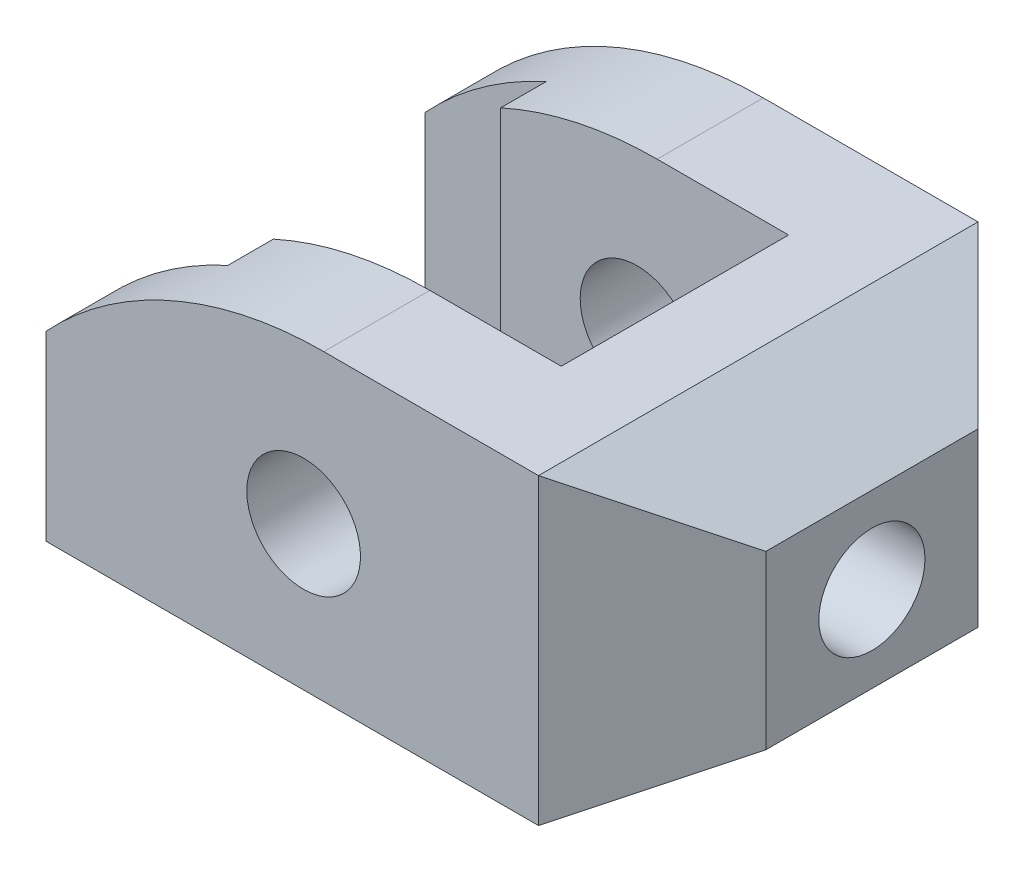
ISO-10303-21;
HEADER;
FILE_DESCRIPTION(('STEP AP214'),'2;1');
FILE_NAME('part.step','',(''),(''),'','','');
FILE_SCHEMA(('AUTOMOTIVE_DESIGN { 1 0 10303 214 1 1 1 1 }'));
ENDSEC;
DATA;
#1=APPLICATION_CONTEXT('core data for automotive mechanical design processes');
#2=APPLICATION_PROTOCOL_DEFINITION('international standard','automotive_design',2000,#1);
#3=PRODUCT_CONTEXT('',#1,'mechanical');
#4=PRODUCT('Part','Part','',(#3));
#5=PRODUCT_RELATED_PRODUCT_CATEGORY('part','',(#4));
#6=PRODUCT_DEFINITION_FORMATION('','',#4);
#7=PRODUCT_DEFINITION_CONTEXT('part definition',#1,'design');
#8=PRODUCT_DEFINITION('design','',#6,#7);
#9=PRODUCT_DEFINITION_SHAPE('','',#8);
#10=(LENGTH_UNIT() NAMED_UNIT(*) SI_UNIT(.MILLI.,.METRE.));
#11=(NAMED_UNIT(*) PLANE_ANGLE_UNIT() SI_UNIT($,.RADIAN.));
#12=(NAMED_UNIT(*) SI_UNIT($,.STERADIAN.) SOLID_ANGLE_UNIT());
#13=UNCERTAINTY_MEASURE_WITH_UNIT(LENGTH_MEASURE(1.E-05),#10,'distance_accuracy_value','');
#14=(GEOMETRIC_REPRESENTATION_CONTEXT(3) GLOBAL_UNCERTAINTY_ASSIGNED_CONTEXT((#13)) GLOBAL_UNIT_ASSIGNED_CONTEXT((#10,
#11,#12)) REPRESENTATION_CONTEXT('',''));
#15=CARTESIAN_POINT('',(0.,0.,0.));
#16=DIRECTION('',(0.,0.,1.));
#17=DIRECTION('',(1.,0.,0.));
#18=AXIS2_PLACEMENT_3D('',#15,#16,#17);
#19=CARTESIAN_POINT('',(36.6606055596467,-10.,29.));
#20=DIRECTION('',(0.,0.,1.));
#21=DIRECTION('',(1.,0.,0.));
#22=AXIS2_PLACEMENT_3D('',#19,#20,#21);
#23=PLANE('',#22);
#24=CARTESIAN_POINT('',(34.,19.,29.));
#25=DIRECTION('',(0.,0.,1.));
#26=DIRECTION('',(1.,0.,0.));
#27=AXIS2_PLACEMENT_3D('',#24,#25,#26);
#28=CIRCLE('',#27,7.5);
#29=CARTESIAN_POINT('',(26.5,19.,29.));
#30=VERTEX_POINT('',#29);
#31=EDGE_CURVE('E254',#30,#30,#28,.T.);
#32=ORIENTED_EDGE('',*,*,#31,.F.);
#33=EDGE_LOOP('',(#32));
#34=FACE_BOUND('',#33,.T.);
#35=DIRECTION('',(1.,0.,0.));
#36=VECTOR('',#35,1.);
#37=CARTESIAN_POINT('',(0.,0.,29.));
#38=LINE('',#37,#36);
#39=CARTESIAN_POINT('',(0.,0.,29.));
#40=VERTEX_POINT('',#39);
#41=CARTESIAN_POINT('',(65.,0.,29.));
#42=VERTEX_POINT('',#41);
#43=EDGE_CURVE('E232',#40,#42,#38,.T.);
#44=ORIENTED_EDGE('',*,*,#43,.T.);
#45=DIRECTION('',(0.,-1.,0.));
#46=VECTOR('',#45,1.);
#47=CARTESIAN_POINT('',(65.,72.,29.));
#48=LINE('',#47,#46);
#49=CARTESIAN_POINT('',(65.,40.,29.));
#50=VERTEX_POINT('',#49);
#51=EDGE_CURVE('E222',#50,#42,#48,.T.);
#52=ORIENTED_EDGE('',*,*,#51,.F.);
#53=DIRECTION('',(-1.,0.,0.));
#54=VECTOR('',#53,1.);
#55=CARTESIAN_POINT('',(65.,40.,29.));
#56=LINE('',#55,#54);
#57=CARTESIAN_POINT('',(36.6606055596467,40.,29.));
#58=VERTEX_POINT('',#57);
#59=EDGE_CURVE('E229',#50,#58,#56,.T.);
#60=ORIENTED_EDGE('',*,*,#59,.T.);
#61=CARTESIAN_POINT('',(36.6606055596467,-10.,29.));
#62=DIRECTION('',(0.,0.,1.));
#63=DIRECTION('',(1.,0.,0.));
#64=AXIS2_PLACEMENT_3D('',#61,#62,#63);
#65=CIRCLE('',#64,50.);
#66=CARTESIAN_POINT('',(0.,24.,29.));
#67=VERTEX_POINT('',#66);
#68=EDGE_CURVE('E246',#58,#67,#65,.T.);
#69=ORIENTED_EDGE('',*,*,#68,.T.);
#70=DIRECTION('',(0.,-1.,0.));
#71=VECTOR('',#70,1.);
#72=CARTESIAN_POINT('',(0.,0.,29.));
#73=LINE('',#72,#71);
#74=EDGE_CURVE('E250',#67,#40,#73,.T.);
#75=ORIENTED_EDGE('',*,*,#74,.T.);
#76=EDGE_LOOP('',(#44,#52,#60,#69,#75));
#77=FACE_BOUND('',#76,.T.);
#78=ADVANCED_FACE('F37',(#34,#77),#23,.T.);
#79=CARTESIAN_POINT('',(36.6606055596467,-10.,-29.));
#80=DIRECTION('',(0.,0.,1.));
#81=DIRECTION('',(1.,0.,0.));
#82=AXIS2_PLACEMENT_3D('',#79,#80,#81);
#83=PLANE('',#82);
#84=CARTESIAN_POINT('',(34.,19.,-29.));
#85=DIRECTION('',(0.,0.,1.));
#86=DIRECTION('',(1.,0.,0.));
#87=AXIS2_PLACEMENT_3D('',#84,#85,#86);
#88=CIRCLE('',#87,7.5);
#89=CARTESIAN_POINT('',(26.5,19.,-29.));
#90=VERTEX_POINT('',#89);
#91=EDGE_CURVE('E319',#90,#90,#88,.T.);
#92=ORIENTED_EDGE('',*,*,#91,.T.);
#93=EDGE_LOOP('',(#92));
#94=FACE_BOUND('',#93,.T.);
#95=DIRECTION('',(0.,-1.,0.));
#96=VECTOR('',#95,1.);
#97=CARTESIAN_POINT('',(65.,72.,-29.));
#98=LINE('',#97,#96);
#99=CARTESIAN_POINT('',(65.,40.,-29.));
#100=VERTEX_POINT('',#99);
#101=CARTESIAN_POINT('',(65.,0.,-29.));
#102=VERTEX_POINT('',#101);
#103=EDGE_CURVE('E152',#100,#102,#98,.T.);
#104=ORIENTED_EDGE('',*,*,#103,.T.);
#105=DIRECTION('',(1.,0.,0.));
#106=VECTOR('',#105,1.);
#107=CARTESIAN_POINT('',(0.,0.,-29.));
#108=LINE('',#107,#106);
#109=CARTESIAN_POINT('',(0.,0.,-29.));
#110=VERTEX_POINT('',#109);
#111=EDGE_CURVE('E168',#110,#102,#108,.T.);
#112=ORIENTED_EDGE('',*,*,#111,.F.);
#113=DIRECTION('',(0.,-1.,0.));
#114=VECTOR('',#113,1.);
#115=CARTESIAN_POINT('',(0.,0.,-29.));
#116=LINE('',#115,#114);
#117=CARTESIAN_POINT('',(0.,24.,-29.));
#118=VERTEX_POINT('',#117);
#119=EDGE_CURVE('E182',#118,#110,#116,.T.);
#120=ORIENTED_EDGE('',*,*,#119,.F.);
#121=CARTESIAN_POINT('',(36.6606055596467,-10.,-29.));
#122=DIRECTION('',(0.,0.,1.));
#123=DIRECTION('',(1.,0.,0.));
#124=AXIS2_PLACEMENT_3D('',#121,#122,#123);
#125=CIRCLE('',#124,50.);
#126=CARTESIAN_POINT('',(36.6606055596467,40.,-29.));
#127=VERTEX_POINT('',#126);
#128=EDGE_CURVE('E257',#127,#118,#125,.T.);
#129=ORIENTED_EDGE('',*,*,#128,.F.);
#130=DIRECTION('',(-1.,0.,0.));
#131=VECTOR('',#130,1.);
#132=CARTESIAN_POINT('',(65.,40.,-29.));
#133=LINE('',#132,#131);
#134=EDGE_CURVE('E172',#100,#127,#133,.T.);
#135=ORIENTED_EDGE('',*,*,#134,.F.);
#136=EDGE_LOOP('',(#104,#112,#120,#129,#135));
#137=FACE_BOUND('',#136,.T.);
#138=ADVANCED_FACE('F166',(#94,#137),#83,.F.);
#139=CARTESIAN_POINT('',(65.,0.,29.));
#140=DIRECTION('',(-0.500000000000001,0.866025403784438,0.));
#141=DIRECTION('',(-0.866025403784438,-0.500000000000001,0.));
#142=AXIS2_PLACEMENT_3D('',#139,#140,#141);
#143=PLANE('',#142);
#144=DIRECTION('',(-0.65465367070798,-0.37796447300923,-0.654653670707973));
#145=VECTOR('',#144,1.);
#146=CARTESIAN_POINT('',(89.8571428571428,14.3512781198564,-4.14285714285749));
#147=LINE('',#146,#145);
#148=CARTESIAN_POINT('',(80.,8.66025403784441,-14.0000000000002));
#149=VERTEX_POINT('',#148);
#150=EDGE_CURVE('E149',#149,#102,#147,.T.);
#151=ORIENTED_EDGE('',*,*,#150,.F.);
#152=DIRECTION('',(0.,0.,-1.));
#153=VECTOR('',#152,1.);
#154=CARTESIAN_POINT('',(80.,8.66025403784442,29.));
#155=LINE('',#154,#153);
#156=CARTESIAN_POINT('',(80.,8.66025403784441,14.0000000000002));
#157=VERTEX_POINT('',#156);
#158=EDGE_CURVE('E187',#157,#149,#155,.T.);
#159=ORIENTED_EDGE('',*,*,#158,.F.);
#160=DIRECTION('',(0.65465367070798,0.37796447300923,-0.654653670707973));
#161=VECTOR('',#160,1.);
#162=CARTESIAN_POINT('',(65.,0.,29.));
#163=LINE('',#162,#161);
#164=EDGE_CURVE('E160',#42,#157,#163,.T.);
#165=ORIENTED_EDGE('',*,*,#164,.F.);
#166=DIRECTION('',(0.,0.,-1.));
#167=VECTOR('',#166,1.);
#168=CARTESIAN_POINT('',(65.,0.,29.));
#169=LINE('',#168,#167);
#170=EDGE_CURVE('E178',#42,#102,#169,.T.);
#171=ORIENTED_EDGE('',*,*,#170,.T.);
#172=EDGE_LOOP('',(#151,#159,#165,#171));
#173=FACE_BOUND('',#172,.T.);
#174=ADVANCED_FACE('F185',(#173),#143,.F.);
#175=CARTESIAN_POINT('',(80.,8.66025403784442,29.));
#176=DIRECTION('',(-1.,0.,0.));
#177=DIRECTION('',(0.,0.,1.));
#178=AXIS2_PLACEMENT_3D('',#175,#176,#177);
#179=PLANE('',#178);
#180=CARTESIAN_POINT('',(80.,20.,0.));
#181=DIRECTION('',(-1.,0.,0.));
#182=DIRECTION('',(0.,0.,1.));
#183=AXIS2_PLACEMENT_3D('',#180,#181,#182);
#184=CIRCLE('',#183,7.);
#185=CARTESIAN_POINT('',(80.,20.,7.));
#186=VERTEX_POINT('',#185);
#187=EDGE_CURVE('E233',#186,#186,#184,.T.);
#188=ORIENTED_EDGE('',*,*,#187,.T.);
#189=EDGE_LOOP('',(#188));
#190=FACE_BOUND('',#189,.T.);
#191=DIRECTION('',(0.,-1.,0.));
#192=VECTOR('',#191,1.);
#193=CARTESIAN_POINT('',(80.,72.,-14.0000000000002));
#194=LINE('',#193,#192);
#195=CARTESIAN_POINT('',(80.,31.3397459621556,-14.0000000000002));
#196=VERTEX_POINT('',#195);
#197=EDGE_CURVE('E155',#196,#149,#194,.T.);
#198=ORIENTED_EDGE('',*,*,#197,.F.);
#199=DIRECTION('',(0.,0.,-1.));
#200=VECTOR('',#199,1.);
#201=CARTESIAN_POINT('',(80.,31.3397459621556,29.));
#202=LINE('',#201,#200);
#203=CARTESIAN_POINT('',(80.,31.3397459621556,14.0000000000002));
#204=VERTEX_POINT('',#203);
#205=EDGE_CURVE('E191',#204,#196,#202,.T.);
#206=ORIENTED_EDGE('',*,*,#205,.F.);
#207=DIRECTION('',(0.,-1.,0.));
#208=VECTOR('',#207,1.);
#209=CARTESIAN_POINT('',(80.,72.,14.0000000000002));
#210=LINE('',#209,#208);
#211=EDGE_CURVE('E53',#204,#157,#210,.T.);
#212=ORIENTED_EDGE('',*,*,#211,.T.);
#213=ORIENTED_EDGE('',*,*,#158,.T.);
#214=EDGE_LOOP('',(#198,#206,#212,#213));
#215=FACE_BOUND('',#214,.T.);
#216=ADVANCED_FACE('F265',(#190,#215),#179,.F.);
#217=CARTESIAN_POINT('',(80.,31.3397459621556,29.));
#218=DIRECTION('',(-0.500000000000001,-0.866025403784438,0.));
#219=DIRECTION('',(0.866025403784438,-0.500000000000001,0.));
#220=AXIS2_PLACEMENT_3D('',#217,#218,#219);
#221=PLANE('',#220);
#222=DIRECTION('',(0.65465367070798,-0.37796447300923,0.654653670707973));
#223=VECTOR('',#222,1.);
#224=CARTESIAN_POINT('',(98.4285714285714,20.7000052870896,4.42857142857107));
#225=LINE('',#224,#223);
#226=EDGE_CURVE('E11',#100,#196,#225,.T.);
#227=ORIENTED_EDGE('',*,*,#226,.F.);
#228=DIRECTION('',(0.,0.,-1.));
#229=VECTOR('',#228,1.);
#230=CARTESIAN_POINT('',(65.,40.,29.));
#231=LINE('',#230,#229);
#232=EDGE_CURVE('E236',#50,#100,#231,.T.);
#233=ORIENTED_EDGE('',*,*,#232,.F.);
#234=DIRECTION('',(-0.65465367070798,0.37796447300923,0.654653670707973));
#235=VECTOR('',#234,1.);
#236=CARTESIAN_POINT('',(73.5714285714287,35.051283406946,20.4285714285714));
#237=LINE('',#236,#235);
#238=EDGE_CURVE('E46',#204,#50,#237,.T.);
#239=ORIENTED_EDGE('',*,*,#238,.F.);
#240=ORIENTED_EDGE('',*,*,#205,.T.);
#241=EDGE_LOOP('',(#227,#233,#239,#240));
#242=FACE_BOUND('',#241,.T.);
#243=ADVANCED_FACE('F237',(#242),#221,.F.);
#244=CARTESIAN_POINT('',(0.,0.,29.));
#245=DIRECTION('',(1.,0.,0.));
#246=DIRECTION('',(0.,0.,-1.));
#247=AXIS2_PLACEMENT_3D('',#244,#245,#246);
#248=PLANE('',#247);
#249=DIRECTION('',(0.,0.,-1.));
#250=VECTOR('',#249,1.);
#251=CARTESIAN_POINT('',(0.,0.,29.));
#252=LINE('',#251,#250);
#253=CARTESIAN_POINT('',(0.,0.,-21.));
#254=VERTEX_POINT('',#253);
#255=EDGE_CURVE('E181',#254,#110,#252,.T.);
#256=ORIENTED_EDGE('',*,*,#255,.F.);
#257=DIRECTION('',(0.,1.,0.));
#258=VECTOR('',#257,1.);
#259=CARTESIAN_POINT('',(0.,-1.2E-05,-21.));
#260=LINE('',#259,#258);
#261=CARTESIAN_POINT('',(0.,24.,-21.));
#262=VERTEX_POINT('',#261);
#263=EDGE_CURVE('E201',#254,#262,#260,.T.);
#264=ORIENTED_EDGE('',*,*,#263,.T.);
#265=DIRECTION('',(0.,0.,-1.));
#266=VECTOR('',#265,1.);
#267=CARTESIAN_POINT('',(0.,24.,29.));
#268=LINE('',#267,#266);
#269=EDGE_CURVE('E248',#262,#118,#268,.T.);
#270=ORIENTED_EDGE('',*,*,#269,.T.);
#271=ORIENTED_EDGE('',*,*,#119,.T.);
#272=EDGE_LOOP('',(#256,#264,#270,#271));
#273=FACE_BOUND('',#272,.T.);
#274=ADVANCED_FACE('F352',(#273),#248,.F.);
#275=CARTESIAN_POINT('',(36.6606055596467,-10.,29.));
#276=DIRECTION('',(0.,0.,-1.));
#277=DIRECTION('',(-1.,0.,0.));
#278=AXIS2_PLACEMENT_3D('',#275,#276,#277);
#279=CYLINDRICAL_SURFACE('',#278,50.);
#280=ORIENTED_EDGE('',*,*,#269,.F.);
#281=CARTESIAN_POINT('',(36.6606055596467,-10.,-21.));
#282=DIRECTION('',(0.,0.,-1.));
#283=DIRECTION('',(-1.,0.,0.));
#284=AXIS2_PLACEMENT_3D('',#281,#282,#283);
#285=CIRCLE('',#284,50.);
#286=CARTESIAN_POINT('',(16.,35.5317403347236,-21.));
#287=VERTEX_POINT('',#286);
#288=EDGE_CURVE('E214',#262,#287,#285,.T.);
#289=ORIENTED_EDGE('',*,*,#288,.T.);
#290=DIRECTION('',(0.,0.,-1.));
#291=VECTOR('',#290,1.);
#292=CARTESIAN_POINT('',(16.,35.5317403347236,29.));
#293=LINE('',#292,#291);
#294=CARTESIAN_POINT('',(16.,35.5317403347236,-15.));
#295=VERTEX_POINT('',#294);
#296=EDGE_CURVE('E211',#287,#295,#293,.F.);
#297=ORIENTED_EDGE('',*,*,#296,.T.);
#298=CARTESIAN_POINT('',(36.6606055596467,-10.,-15.));
#299=DIRECTION('',(0.,0.,-1.));
#300=DIRECTION('',(-1.,0.,0.));
#301=AXIS2_PLACEMENT_3D('',#298,#299,#300);
#302=CIRCLE('',#301,50.);
#303=CARTESIAN_POINT('',(36.6606055596467,40.,-15.));
#304=VERTEX_POINT('',#303);
#305=EDGE_CURVE('E205',#295,#304,#302,.T.);
#306=ORIENTED_EDGE('',*,*,#305,.T.);
#307=DIRECTION('',(0.,0.,-1.));
#308=VECTOR('',#307,1.);
#309=CARTESIAN_POINT('',(36.6606055596467,40.,29.));
#310=LINE('',#309,#308);
#311=EDGE_CURVE('E263',#304,#127,#310,.T.);
#312=ORIENTED_EDGE('',*,*,#311,.T.);
#313=ORIENTED_EDGE('',*,*,#128,.T.);
#314=EDGE_LOOP('',(#280,#289,#297,#306,#312,#313));
#315=FACE_BOUND('',#314,.T.);
#316=ADVANCED_FACE('F350',(#315),#279,.T.);
#317=CARTESIAN_POINT('',(34.,19.,29.));
#318=DIRECTION('',(0.,0.,-1.));
#319=DIRECTION('',(-1.,0.,0.));
#320=AXIS2_PLACEMENT_3D('',#317,#318,#319);
#321=CYLINDRICAL_SURFACE('',#320,7.5);
#322=CARTESIAN_POINT('',(34.,19.,-15.));
#323=DIRECTION('',(0.,0.,-1.));
#324=DIRECTION('',(-1.,0.,0.));
#325=AXIS2_PLACEMENT_3D('',#322,#323,#324);
#326=CIRCLE('',#325,7.5);
#327=CARTESIAN_POINT('',(26.5,19.,-15.));
#328=VERTEX_POINT('',#327);
#329=EDGE_CURVE('E202',#328,#328,#326,.T.);
#330=CARTESIAN_POINT('',(26.5,19.,-15.));
#331=CARTESIAN_POINT('',(26.5,19.,-15.1458333333333));
#332=CARTESIAN_POINT('',(26.5,19.,-15.2916666666667));
#333=CARTESIAN_POINT('',(26.5,19.,-15.5833333333333));
#334=CARTESIAN_POINT('',(26.5,19.,-15.7291666666667));
#335=CARTESIAN_POINT('',(26.5,19.,-16.0208333333333));
#336=CARTESIAN_POINT('',(26.5,19.,-16.1666666666667));
#337=CARTESIAN_POINT('',(26.5,19.,-16.4583333333333));
#338=CARTESIAN_POINT('',(26.5,19.,-16.6041666666667));
#339=CARTESIAN_POINT('',(26.5,19.,-16.8958333333333));
#340=CARTESIAN_POINT('',(26.5,19.,-17.0416666666667));
#341=CARTESIAN_POINT('',(26.5,19.,-17.3333333333333));
#342=CARTESIAN_POINT('',(26.5,19.,-17.4791666666667));
#343=CARTESIAN_POINT('',(26.5,19.,-17.7708333333333));
#344=CARTESIAN_POINT('',(26.5,19.,-17.9166666666667));
#345=CARTESIAN_POINT('',(26.5,19.,-18.2083333333333));
#346=CARTESIAN_POINT('',(26.5,19.,-18.3541666666667));
#347=CARTESIAN_POINT('',(26.5,19.,-18.6458333333333));
#348=CARTESIAN_POINT('',(26.5,19.,-18.7916666666667));
#349=CARTESIAN_POINT('',(26.5,19.,-19.0833333333333));
#350=CARTESIAN_POINT('',(26.5,19.,-19.2291666666667));
#351=CARTESIAN_POINT('',(26.5,19.,-19.5208333333333));
#352=CARTESIAN_POINT('',(26.5,19.,-19.6666666666667));
#353=CARTESIAN_POINT('',(26.5,19.,-19.9583333333333));
#354=CARTESIAN_POINT('',(26.5,19.,-20.1041666666667));
#355=CARTESIAN_POINT('',(26.5,19.,-20.3958333333333));
#356=CARTESIAN_POINT('',(26.5,19.,-20.5416666666667));
#357=CARTESIAN_POINT('',(26.5,19.,-20.8333333333333));
#358=CARTESIAN_POINT('',(26.5,19.,-20.9791666666667));
#359=CARTESIAN_POINT('',(26.5,19.,-21.2708333333333));
#360=CARTESIAN_POINT('',(26.5,19.,-21.4166666666667));
#361=CARTESIAN_POINT('',(26.5,19.,-21.7083333333333));
#362=CARTESIAN_POINT('',(26.5,19.,-21.8541666666667));
#363=CARTESIAN_POINT('',(26.5,19.,-22.1458333333333));
#364=CARTESIAN_POINT('',(26.5,19.,-22.2916666666667));
#365=CARTESIAN_POINT('',(26.5,19.,-22.5833333333333));
#366=CARTESIAN_POINT('',(26.5,19.,-22.7291666666667));
#367=CARTESIAN_POINT('',(26.5,19.,-23.0208333333333));
#368=CARTESIAN_POINT('',(26.5,19.,-23.1666666666667));
#369=CARTESIAN_POINT('',(26.5,19.,-23.4583333333333));
#370=CARTESIAN_POINT('',(26.5,19.,-23.6041666666667));
#371=CARTESIAN_POINT('',(26.5,19.,-23.8958333333333));
#372=CARTESIAN_POINT('',(26.5,19.,-24.0416666666667));
#373=CARTESIAN_POINT('',(26.5,19.,-24.3333333333333));
#374=CARTESIAN_POINT('',(26.5,19.,-24.4791666666667));
#375=CARTESIAN_POINT('',(26.5,19.,-24.7708333333333));
#376=CARTESIAN_POINT('',(26.5,19.,-24.9166666666667));
#377=CARTESIAN_POINT('',(26.5,19.,-25.2083333333333));
#378=CARTESIAN_POINT('',(26.5,19.,-25.3541666666667));
#379=CARTESIAN_POINT('',(26.5,19.,-25.6458333333333));
#380=CARTESIAN_POINT('',(26.5,19.,-25.7916666666667));
#381=CARTESIAN_POINT('',(26.5,19.,-26.0833333333333));
#382=CARTESIAN_POINT('',(26.5,19.,-26.2291666666667));
#383=CARTESIAN_POINT('',(26.5,19.,-26.5208333333333));
#384=CARTESIAN_POINT('',(26.5,19.,-26.6666666666667));
#385=CARTESIAN_POINT('',(26.5,19.,-26.9583333333333));
#386=CARTESIAN_POINT('',(26.5,19.,-27.1041666666667));
#387=CARTESIAN_POINT('',(26.5,19.,-27.3958333333333));
#388=CARTESIAN_POINT('',(26.5,19.,-27.5416666666667));
#389=CARTESIAN_POINT('',(26.5,19.,-27.8333333333333));
#390=CARTESIAN_POINT('',(26.5,19.,-27.9791666666667));
#391=CARTESIAN_POINT('',(26.5,19.,-28.2708333333333));
#392=CARTESIAN_POINT('',(26.5,19.,-28.4166666666667));
#393=CARTESIAN_POINT('',(26.5,19.,-28.7083333333333));
#394=CARTESIAN_POINT('',(26.5,19.,-28.8541666666667));
#395=CARTESIAN_POINT('',(26.5,19.,-29.));
#396=B_SPLINE_CURVE_WITH_KNOTS('',3,(#330,#331,#332,#333,#334,#335,#336,#337,#338,#339,#340,
#341,#342,#343,#344,#345,#346,#347,#348,#349,#350,#351,#352,#353,#354,#355,#356,#357,#358,#359,
#360,#361,#362,#363,#364,#365,#366,#367,#368,#369,#370,#371,#372,#373,#374,#375,#376,#377,#378,
#379,#380,#381,#382,#383,#384,#385,#386,#387,#388,#389,#390,#391,#392,#393,#394,#395),
.UNSPECIFIED.,.F.,.F.,(4,2,2,2,2,2,2,2,2,2,2,2,2,2,2,2,2,2,2,2,2,2,2,2,2,2,2,2,2,2,2,2,4),(0.,
0.4375,0.875000000000001,1.3125,1.75,2.1875,2.625,3.0625,3.5,3.9375,4.375,4.8125,5.25,
5.68750000000001,6.12500000000001,6.56250000000001,7.00000000000001,7.43750000000001,
7.87500000000001,8.31250000000001,8.75000000000001,9.18750000000001,9.62500000000001,10.0625,
10.5,10.9375,11.375,11.8125,12.25,12.6875,13.125,13.5625,14.),.UNSPECIFIED.);
#397=EDGE_CURVE('BSEAM358',#328,#90,#396,.T.);
#398=ORIENTED_EDGE('',*,*,#329,.F.);
#399=ORIENTED_EDGE('',*,*,#91,.F.);
#400=ORIENTED_EDGE('',*,*,#397,.T.);
#401=ORIENTED_EDGE('',*,*,#397,.F.);
#402=EDGE_LOOP('',(#398,#400,#399,#401));
#403=FACE_BOUND('',#402,.T.);
#404=ADVANCED_FACE('F358',(#403),#321,.F.);
#405=CARTESIAN_POINT('',(0.,24.,21.));
#406=VERTEX_POINT('',#405);
#407=EDGE_CURVE('E260',#67,#406,#268,.T.);
#408=ORIENTED_EDGE('',*,*,#407,.T.);
#409=DIRECTION('',(0.,1.,0.));
#410=VECTOR('',#409,1.);
#411=CARTESIAN_POINT('',(0.,-1.2E-05,21.));
#412=LINE('',#411,#410);
#413=CARTESIAN_POINT('',(0.,0.,21.));
#414=VERTEX_POINT('',#413);
#415=EDGE_CURVE('E61',#414,#406,#412,.T.);
#416=ORIENTED_EDGE('',*,*,#415,.F.);
#417=EDGE_CURVE('E189',#40,#414,#252,.T.);
#418=ORIENTED_EDGE('',*,*,#417,.F.);
#419=ORIENTED_EDGE('',*,*,#74,.F.);
#420=EDGE_LOOP('',(#408,#416,#418,#419));
#421=FACE_BOUND('',#420,.T.);
#422=ADVANCED_FACE('F39',(#421),#248,.F.);
#423=CARTESIAN_POINT('',(0.,0.,29.));
#424=DIRECTION('',(0.,1.,0.));
#425=DIRECTION('',(0.,0.,1.));
#426=AXIS2_PLACEMENT_3D('',#423,#424,#425);
#427=PLANE('',#426);
#428=DIRECTION('',(0.,0.,-1.));
#429=VECTOR('',#428,1.);
#430=CARTESIAN_POINT('',(16.,0.,29.));
#431=LINE('',#430,#429);
#432=CARTESIAN_POINT('',(16.,0.,-15.));
#433=VERTEX_POINT('',#432);
#434=CARTESIAN_POINT('',(16.,0.,-21.));
#435=VERTEX_POINT('',#434);
#436=EDGE_CURVE('E312',#433,#435,#431,.T.);
#437=ORIENTED_EDGE('',*,*,#436,.T.);
#438=DIRECTION('',(-1.,0.,0.));
#439=VECTOR('',#438,1.);
#440=CARTESIAN_POINT('',(0.,0.,-21.));
#441=LINE('',#440,#439);
#442=EDGE_CURVE('E314',#435,#254,#441,.T.);
#443=ORIENTED_EDGE('',*,*,#442,.T.);
#444=ORIENTED_EDGE('',*,*,#255,.T.);
#445=ORIENTED_EDGE('',*,*,#111,.T.);
#446=ORIENTED_EDGE('',*,*,#170,.F.);
#447=ORIENTED_EDGE('',*,*,#43,.F.);
#448=ORIENTED_EDGE('',*,*,#417,.T.);
#449=DIRECTION('',(1.,0.,0.));
#450=VECTOR('',#449,1.);
#451=CARTESIAN_POINT('',(0.,0.,21.));
#452=LINE('',#451,#450);
#453=CARTESIAN_POINT('',(16.,0.,21.));
#454=VERTEX_POINT('',#453);
#455=EDGE_CURVE('E306',#414,#454,#452,.T.);
#456=ORIENTED_EDGE('',*,*,#455,.T.);
#457=DIRECTION('',(0.,0.,-1.));
#458=VECTOR('',#457,1.);
#459=CARTESIAN_POINT('',(16.,0.,29.));
#460=LINE('',#459,#458);
#461=CARTESIAN_POINT('',(16.,0.,15.));
#462=VERTEX_POINT('',#461);
#463=EDGE_CURVE('E309',#454,#462,#460,.T.);
#464=ORIENTED_EDGE('',*,*,#463,.T.);
#465=DIRECTION('',(1.,0.,0.));
#466=VECTOR('',#465,1.);
#467=CARTESIAN_POINT('',(0.,0.,15.));
#468=LINE('',#467,#466);
#469=CARTESIAN_POINT('',(54.,0.,15.));
#470=VERTEX_POINT('',#469);
#471=EDGE_CURVE('E206',#462,#470,#468,.T.);
#472=ORIENTED_EDGE('',*,*,#471,.T.);
#473=DIRECTION('',(0.,0.,-1.));
#474=VECTOR('',#473,1.);
#475=CARTESIAN_POINT('',(54.,0.,29.));
#476=LINE('',#475,#474);
#477=CARTESIAN_POINT('',(54.,0.,-15.));
#478=VERTEX_POINT('',#477);
#479=EDGE_CURVE('E316',#470,#478,#476,.T.);
#480=ORIENTED_EDGE('',*,*,#479,.T.);
#481=DIRECTION('',(-1.,0.,0.));
#482=VECTOR('',#481,1.);
#483=CARTESIAN_POINT('',(0.,0.,-15.));
#484=LINE('',#483,#482);
#485=EDGE_CURVE('E303',#478,#433,#484,.T.);
#486=ORIENTED_EDGE('',*,*,#485,.T.);
#487=EDGE_LOOP('',(#437,#443,#444,#445,#446,#447,#448,#456,#464,#472,#480,#486));
#488=FACE_BOUND('',#487,.T.);
#489=ADVANCED_FACE('F177',(#488),#427,.F.);
#490=CARTESIAN_POINT('',(65.,40.,29.));
#491=DIRECTION('',(0.,-1.,0.));
#492=DIRECTION('',(1.,0.,0.));
#493=AXIS2_PLACEMENT_3D('',#490,#491,#492);
#494=PLANE('',#493);
#495=ORIENTED_EDGE('',*,*,#311,.F.);
#496=DIRECTION('',(1.,0.,0.));
#497=VECTOR('',#496,1.);
#498=CARTESIAN_POINT('',(65.,40.,-15.));
#499=LINE('',#498,#497);
#500=CARTESIAN_POINT('',(54.,40.,-15.));
#501=VERTEX_POINT('',#500);
#502=EDGE_CURVE('E300',#304,#501,#499,.T.);
#503=ORIENTED_EDGE('',*,*,#502,.T.);
#504=DIRECTION('',(0.,0.,1.));
#505=VECTOR('',#504,1.);
#506=CARTESIAN_POINT('',(54.,40.,29.));
#507=LINE('',#506,#505);
#508=CARTESIAN_POINT('',(54.,40.,15.));
#509=VERTEX_POINT('',#508);
#510=EDGE_CURVE('E217',#501,#509,#507,.T.);
#511=ORIENTED_EDGE('',*,*,#510,.T.);
#512=DIRECTION('',(-1.,0.,0.));
#513=VECTOR('',#512,1.);
#514=CARTESIAN_POINT('',(65.,40.,15.));
#515=LINE('',#514,#513);
#516=CARTESIAN_POINT('',(36.6606055596467,40.,15.));
#517=VERTEX_POINT('',#516);
#518=EDGE_CURVE('E294',#509,#517,#515,.T.);
#519=ORIENTED_EDGE('',*,*,#518,.T.);
#520=EDGE_CURVE('E239',#58,#517,#310,.T.);
#521=ORIENTED_EDGE('',*,*,#520,.F.);
#522=ORIENTED_EDGE('',*,*,#59,.F.);
#523=ORIENTED_EDGE('',*,*,#232,.T.);
#524=ORIENTED_EDGE('',*,*,#134,.T.);
#525=EDGE_LOOP('',(#495,#503,#511,#519,#521,#522,#523,#524));
#526=FACE_BOUND('',#525,.T.);
#527=ADVANCED_FACE('F242',(#526),#494,.F.);
#528=ORIENTED_EDGE('',*,*,#520,.T.);
#529=CARTESIAN_POINT('',(36.6606055596467,-10.,15.));
#530=DIRECTION('',(0.,0.,1.));
#531=DIRECTION('',(1.,0.,0.));
#532=AXIS2_PLACEMENT_3D('',#529,#530,#531);
#533=CIRCLE('',#532,50.);
#534=CARTESIAN_POINT('',(16.,35.5317403347236,15.));
#535=VERTEX_POINT('',#534);
#536=EDGE_CURVE('E200',#517,#535,#533,.T.);
#537=ORIENTED_EDGE('',*,*,#536,.T.);
#538=DIRECTION('',(0.,0.,-1.));
#539=VECTOR('',#538,1.);
#540=CARTESIAN_POINT('',(16.,35.5317403347236,29.));
#541=LINE('',#540,#539);
#542=CARTESIAN_POINT('',(16.,35.5317403347236,21.));
#543=VERTEX_POINT('',#542);
#544=EDGE_CURVE('E208',#535,#543,#541,.F.);
#545=ORIENTED_EDGE('',*,*,#544,.T.);
#546=CARTESIAN_POINT('',(36.6606055596467,-10.,21.));
#547=DIRECTION('',(0.,0.,1.));
#548=DIRECTION('',(1.,0.,0.));
#549=AXIS2_PLACEMENT_3D('',#546,#547,#548);
#550=CIRCLE('',#549,50.);
#551=EDGE_CURVE('E196',#543,#406,#550,.T.);
#552=ORIENTED_EDGE('',*,*,#551,.T.);
#553=ORIENTED_EDGE('',*,*,#407,.F.);
#554=ORIENTED_EDGE('',*,*,#68,.F.);
#555=EDGE_LOOP('',(#528,#537,#545,#552,#553,#554));
#556=FACE_BOUND('',#555,.T.);
#557=ADVANCED_FACE('F333',(#556),#279,.T.);
#558=CARTESIAN_POINT('',(34.,19.,15.));
#559=DIRECTION('',(0.,0.,1.));
#560=DIRECTION('',(1.,0.,0.));
#561=AXIS2_PLACEMENT_3D('',#558,#559,#560);
#562=CIRCLE('',#561,7.5);
#563=CARTESIAN_POINT('',(26.5,19.,15.));
#564=VERTEX_POINT('',#563);
#565=EDGE_CURVE('E197',#564,#564,#562,.T.);
#566=CARTESIAN_POINT('',(26.5,19.,15.));
#567=CARTESIAN_POINT('',(26.5,19.,15.1458333333333));
#568=CARTESIAN_POINT('',(26.5,19.,15.2916666666667));
#569=CARTESIAN_POINT('',(26.5,19.,15.5833333333333));
#570=CARTESIAN_POINT('',(26.5,19.,15.7291666666667));
#571=CARTESIAN_POINT('',(26.5,19.,16.0208333333333));
#572=CARTESIAN_POINT('',(26.5,19.,16.1666666666667));
#573=CARTESIAN_POINT('',(26.5,19.,16.4583333333333));
#574=CARTESIAN_POINT('',(26.5,19.,16.6041666666667));
#575=CARTESIAN_POINT('',(26.5,19.,16.8958333333333));
#576=CARTESIAN_POINT('',(26.5,19.,17.0416666666667));
#577=CARTESIAN_POINT('',(26.5,19.,17.3333333333333));
#578=CARTESIAN_POINT('',(26.5,19.,17.4791666666667));
#579=CARTESIAN_POINT('',(26.5,19.,17.7708333333333));
#580=CARTESIAN_POINT('',(26.5,19.,17.9166666666667));
#581=CARTESIAN_POINT('',(26.5,19.,18.2083333333333));
#582=CARTESIAN_POINT('',(26.5,19.,18.3541666666667));
#583=CARTESIAN_POINT('',(26.5,19.,18.6458333333333));
#584=CARTESIAN_POINT('',(26.5,19.,18.7916666666667));
#585=CARTESIAN_POINT('',(26.5,19.,19.0833333333333));
#586=CARTESIAN_POINT('',(26.5,19.,19.2291666666667));
#587=CARTESIAN_POINT('',(26.5,19.,19.5208333333333));
#588=CARTESIAN_POINT('',(26.5,19.,19.6666666666667));
#589=CARTESIAN_POINT('',(26.5,19.,19.9583333333333));
#590=CARTESIAN_POINT('',(26.5,19.,20.1041666666667));
#591=CARTESIAN_POINT('',(26.5,19.,20.3958333333333));
#592=CARTESIAN_POINT('',(26.5,19.,20.5416666666667));
#593=CARTESIAN_POINT('',(26.5,19.,20.8333333333333));
#594=CARTESIAN_POINT('',(26.5,19.,20.9791666666667));
#595=CARTESIAN_POINT('',(26.5,19.,21.2708333333333));
#596=CARTESIAN_POINT('',(26.5,19.,21.4166666666667));
#597=CARTESIAN_POINT('',(26.5,19.,21.7083333333333));
#598=CARTESIAN_POINT('',(26.5,19.,21.8541666666667));
#599=CARTESIAN_POINT('',(26.5,19.,22.1458333333333));
#600=CARTESIAN_POINT('',(26.5,19.,22.2916666666667));
#601=CARTESIAN_POINT('',(26.5,19.,22.5833333333333));
#602=CARTESIAN_POINT('',(26.5,19.,22.7291666666667));
#603=CARTESIAN_POINT('',(26.5,19.,23.0208333333333));
#604=CARTESIAN_POINT('',(26.5,19.,23.1666666666667));
#605=CARTESIAN_POINT('',(26.5,19.,23.4583333333333));
#606=CARTESIAN_POINT('',(26.5,19.,23.6041666666667));
#607=CARTESIAN_POINT('',(26.5,19.,23.8958333333333));
#608=CARTESIAN_POINT('',(26.5,19.,24.0416666666667));
#609=CARTESIAN_POINT('',(26.5,19.,24.3333333333333));
#610=CARTESIAN_POINT('',(26.5,19.,24.4791666666667));
#611=CARTESIAN_POINT('',(26.5,19.,24.7708333333333));
#612=CARTESIAN_POINT('',(26.5,19.,24.9166666666667));
#613=CARTESIAN_POINT('',(26.5,19.,25.2083333333333));
#614=CARTESIAN_POINT('',(26.5,19.,25.3541666666667));
#615=CARTESIAN_POINT('',(26.5,19.,25.6458333333333));
#616=CARTESIAN_POINT('',(26.5,19.,25.7916666666667));
#617=CARTESIAN_POINT('',(26.5,19.,26.0833333333333));
#618=CARTESIAN_POINT('',(26.5,19.,26.2291666666667));
#619=CARTESIAN_POINT('',(26.5,19.,26.5208333333333));
#620=CARTESIAN_POINT('',(26.5,19.,26.6666666666667));
#621=CARTESIAN_POINT('',(26.5,19.,26.9583333333333));
#622=CARTESIAN_POINT('',(26.5,19.,27.1041666666667));
#623=CARTESIAN_POINT('',(26.5,19.,27.3958333333333));
#624=CARTESIAN_POINT('',(26.5,19.,27.5416666666667));
#625=CARTESIAN_POINT('',(26.5,19.,27.8333333333333));
#626=CARTESIAN_POINT('',(26.5,19.,27.9791666666667));
#627=CARTESIAN_POINT('',(26.5,19.,28.2708333333333));
#628=CARTESIAN_POINT('',(26.5,19.,28.4166666666667));
#629=CARTESIAN_POINT('',(26.5,19.,28.7083333333333));
#630=CARTESIAN_POINT('',(26.5,19.,28.8541666666667));
#631=CARTESIAN_POINT('',(26.5,19.,29.));
#632=B_SPLINE_CURVE_WITH_KNOTS('',3,(#566,#567,#568,#569,#570,#571,#572,#573,#574,#575,#576,
#577,#578,#579,#580,#581,#582,#583,#584,#585,#586,#587,#588,#589,#590,#591,#592,#593,#594,#595,
#596,#597,#598,#599,#600,#601,#602,#603,#604,#605,#606,#607,#608,#609,#610,#611,#612,#613,#614,
#615,#616,#617,#618,#619,#620,#621,#622,#623,#624,#625,#626,#627,#628,#629,#630,#631),
.UNSPECIFIED.,.F.,.F.,(4,2,2,2,2,2,2,2,2,2,2,2,2,2,2,2,2,2,2,2,2,2,2,2,2,2,2,2,2,2,2,2,4),(0.,
0.4375,0.874999999999999,1.3125,1.75,2.1875,2.625,3.0625,3.5,3.9375,4.375,4.8125,5.25,5.6875,
6.125,6.5625,7.,7.4375,7.875,8.3125,8.75,9.1875,9.625,10.0625,10.5,10.9375,11.375,11.8125,12.25,
12.6875,13.125,13.5625,14.),.UNSPECIFIED.);
#633=EDGE_CURVE('BSEAM372',#564,#30,#632,.T.);
#634=ORIENTED_EDGE('',*,*,#565,.F.);
#635=ORIENTED_EDGE('',*,*,#31,.T.);
#636=ORIENTED_EDGE('',*,*,#633,.T.);
#637=ORIENTED_EDGE('',*,*,#633,.F.);
#638=EDGE_LOOP('',(#634,#636,#635,#637));
#639=FACE_BOUND('',#638,.T.);
#640=ADVANCED_FACE('F372',(#639),#321,.F.);
#641=CARTESIAN_POINT('',(54.,-1.2E-05,-15.));
#642=DIRECTION('',(1.,0.,0.));
#643=DIRECTION('',(0.,0.,-1.));
#644=AXIS2_PLACEMENT_3D('',#641,#642,#643);
#645=PLANE('',#644);
#646=CARTESIAN_POINT('',(54.,20.,0.));
#647=DIRECTION('',(1.,0.,0.));
#648=DIRECTION('',(0.,0.,-1.));
#649=AXIS2_PLACEMENT_3D('',#646,#647,#648);
#650=CIRCLE('',#649,7.);
#651=CARTESIAN_POINT('',(54.,20.,-7.));
#652=VERTEX_POINT('',#651);
#653=EDGE_CURVE('E41',#652,#652,#650,.T.);
#654=ORIENTED_EDGE('',*,*,#653,.T.);
#655=EDGE_LOOP('',(#654));
#656=FACE_BOUND('',#655,.T.);
#657=DIRECTION('',(0.,1.,0.));
#658=VECTOR('',#657,1.);
#659=CARTESIAN_POINT('',(54.,-1.2E-05,15.));
#660=LINE('',#659,#658);
#661=EDGE_CURVE('E282',#470,#509,#660,.T.);
#662=ORIENTED_EDGE('',*,*,#661,.T.);
#663=ORIENTED_EDGE('',*,*,#510,.F.);
#664=DIRECTION('',(0.,1.,0.));
#665=VECTOR('',#664,1.);
#666=CARTESIAN_POINT('',(54.,-1.2E-05,-15.));
#667=LINE('',#666,#665);
#668=EDGE_CURVE('E279',#478,#501,#667,.T.);
#669=ORIENTED_EDGE('',*,*,#668,.F.);
#670=ORIENTED_EDGE('',*,*,#479,.F.);
#671=EDGE_LOOP('',(#662,#663,#669,#670));
#672=FACE_BOUND('',#671,.T.);
#673=ADVANCED_FACE('F339',(#656,#672),#645,.F.);
#674=CARTESIAN_POINT('',(0.,-1.2E-05,-21.));
#675=DIRECTION('',(0.,0.,-1.));
#676=DIRECTION('',(-1.,0.,0.));
#677=AXIS2_PLACEMENT_3D('',#674,#675,#676);
#678=PLANE('',#677);
#679=DIRECTION('',(0.,1.,0.));
#680=VECTOR('',#679,1.);
#681=CARTESIAN_POINT('',(16.,-1.2E-05,-21.));
#682=LINE('',#681,#680);
#683=EDGE_CURVE('E273',#435,#287,#682,.T.);
#684=ORIENTED_EDGE('',*,*,#683,.T.);
#685=ORIENTED_EDGE('',*,*,#288,.F.);
#686=ORIENTED_EDGE('',*,*,#263,.F.);
#687=ORIENTED_EDGE('',*,*,#442,.F.);
#688=EDGE_LOOP('',(#684,#685,#686,#687));
#689=FACE_BOUND('',#688,.T.);
#690=ADVANCED_FACE('F347',(#689),#678,.F.);
#691=CARTESIAN_POINT('',(16.,-1.2E-05,-21.));
#692=DIRECTION('',(1.,0.,0.));
#693=DIRECTION('',(0.,0.,-1.));
#694=AXIS2_PLACEMENT_3D('',#691,#692,#693);
#695=PLANE('',#694);
#696=DIRECTION('',(0.,1.,0.));
#697=VECTOR('',#696,1.);
#698=CARTESIAN_POINT('',(16.,-1.2E-05,-15.));
#699=LINE('',#698,#697);
#700=EDGE_CURVE('E276',#433,#295,#699,.T.);
#701=ORIENTED_EDGE('',*,*,#700,.T.);
#702=ORIENTED_EDGE('',*,*,#296,.F.);
#703=ORIENTED_EDGE('',*,*,#683,.F.);
#704=ORIENTED_EDGE('',*,*,#436,.F.);
#705=EDGE_LOOP('',(#701,#702,#703,#704));
#706=FACE_BOUND('',#705,.T.);
#707=ADVANCED_FACE('F345',(#706),#695,.F.);
#708=CARTESIAN_POINT('',(16.,-1.2E-05,15.));
#709=DIRECTION('',(1.,0.,0.));
#710=DIRECTION('',(0.,0.,-1.));
#711=AXIS2_PLACEMENT_3D('',#708,#709,#710);
#712=PLANE('',#711);
#713=DIRECTION('',(0.,1.,0.));
#714=VECTOR('',#713,1.);
#715=CARTESIAN_POINT('',(16.,-1.2E-05,21.));
#716=LINE('',#715,#714);
#717=EDGE_CURVE('E288',#454,#543,#716,.T.);
#718=ORIENTED_EDGE('',*,*,#717,.T.);
#719=ORIENTED_EDGE('',*,*,#544,.F.);
#720=DIRECTION('',(0.,1.,0.));
#721=VECTOR('',#720,1.);
#722=CARTESIAN_POINT('',(16.,-1.2E-05,15.));
#723=LINE('',#722,#721);
#724=EDGE_CURVE('E285',#462,#535,#723,.T.);
#725=ORIENTED_EDGE('',*,*,#724,.F.);
#726=ORIENTED_EDGE('',*,*,#463,.F.);
#727=EDGE_LOOP('',(#718,#719,#725,#726));
#728=FACE_BOUND('',#727,.T.);
#729=ADVANCED_FACE('F330',(#728),#712,.F.);
#730=CARTESIAN_POINT('',(0.,-1.2E-05,21.));
#731=DIRECTION('',(0.,0.,1.));
#732=DIRECTION('',(1.,0.,0.));
#733=AXIS2_PLACEMENT_3D('',#730,#731,#732);
#734=PLANE('',#733);
#735=ORIENTED_EDGE('',*,*,#415,.T.);
#736=ORIENTED_EDGE('',*,*,#551,.F.);
#737=ORIENTED_EDGE('',*,*,#717,.F.);
#738=ORIENTED_EDGE('',*,*,#455,.F.);
#739=EDGE_LOOP('',(#735,#736,#737,#738));
#740=FACE_BOUND('',#739,.T.);
#741=ADVANCED_FACE('F328',(#740),#734,.F.);
#742=CARTESIAN_POINT('',(16.,-1.2E-05,-15.));
#743=DIRECTION('',(0.,0.,-1.));
#744=DIRECTION('',(-1.,0.,0.));
#745=AXIS2_PLACEMENT_3D('',#742,#743,#744);
#746=PLANE('',#745);
#747=ORIENTED_EDGE('',*,*,#329,.T.);
#748=EDGE_LOOP('',(#747));
#749=FACE_BOUND('',#748,.T.);
#750=ORIENTED_EDGE('',*,*,#668,.T.);
#751=ORIENTED_EDGE('',*,*,#502,.F.);
#752=ORIENTED_EDGE('',*,*,#305,.F.);
#753=ORIENTED_EDGE('',*,*,#700,.F.);
#754=ORIENTED_EDGE('',*,*,#485,.F.);
#755=EDGE_LOOP('',(#750,#751,#752,#753,#754));
#756=FACE_BOUND('',#755,.T.);
#757=ADVANCED_FACE('F341',(#749,#756),#746,.F.);
#758=CARTESIAN_POINT('',(16.,-1.2E-05,15.));
#759=DIRECTION('',(0.,0.,1.));
#760=DIRECTION('',(1.,0.,0.));
#761=AXIS2_PLACEMENT_3D('',#758,#759,#760);
#762=PLANE('',#761);
#763=ORIENTED_EDGE('',*,*,#565,.T.);
#764=EDGE_LOOP('',(#763));
#765=FACE_BOUND('',#764,.T.);
#766=ORIENTED_EDGE('',*,*,#724,.T.);
#767=ORIENTED_EDGE('',*,*,#536,.F.);
#768=ORIENTED_EDGE('',*,*,#518,.F.);
#769=ORIENTED_EDGE('',*,*,#661,.F.);
#770=ORIENTED_EDGE('',*,*,#471,.F.);
#771=EDGE_LOOP('',(#766,#767,#768,#769,#770));
#772=FACE_BOUND('',#771,.T.);
#773=ADVANCED_FACE('F335',(#765,#772),#762,.F.);
#774=CARTESIAN_POINT('',(65.,72.,29.));
#775=DIRECTION('',(0.707106781186544,0.,0.707106781186551));
#776=DIRECTION('',(0.707106781186551,0.,-0.707106781186544));
#777=AXIS2_PLACEMENT_3D('',#774,#775,#776);
#778=PLANE('',#777);
#779=ORIENTED_EDGE('',*,*,#164,.T.);
#780=ORIENTED_EDGE('',*,*,#211,.F.);
#781=ORIENTED_EDGE('',*,*,#238,.T.);
#782=ORIENTED_EDGE('',*,*,#51,.T.);
#783=EDGE_LOOP('',(#779,#780,#781,#782));
#784=FACE_BOUND('',#783,.T.);
#785=ADVANCED_FACE('F221',(#784),#778,.T.);
#786=CARTESIAN_POINT('',(65.,72.,-29.));
#787=DIRECTION('',(0.707106781186543,0.,-0.707106781186551));
#788=DIRECTION('',(-0.707106781186552,0.,-0.707106781186544));
#789=AXIS2_PLACEMENT_3D('',#786,#787,#788);
#790=PLANE('',#789);
#791=ORIENTED_EDGE('',*,*,#150,.T.);
#792=ORIENTED_EDGE('',*,*,#103,.F.);
#793=ORIENTED_EDGE('',*,*,#226,.T.);
#794=ORIENTED_EDGE('',*,*,#197,.T.);
#795=EDGE_LOOP('',(#791,#792,#793,#794));
#796=FACE_BOUND('',#795,.T.);
#797=ADVANCED_FACE('F151',(#796),#790,.T.);
#798=CARTESIAN_POINT('',(0.,20.,0.));
#799=DIRECTION('',(1.,0.,0.));
#800=DIRECTION('',(0.,0.,-1.));
#801=AXIS2_PLACEMENT_3D('',#798,#799,#800);
#802=CYLINDRICAL_SURFACE('',#801,7.);
#803=ORIENTED_EDGE('',*,*,#653,.F.);
#804=EDGE_LOOP('',(#803));
#805=FACE_BOUND('',#804,.T.);
#806=ORIENTED_EDGE('',*,*,#187,.F.);
#807=EDGE_LOOP('',(#806));
#808=FACE_BOUND('',#807,.T.);
#809=ADVANCED_FACE('F461',(#805,#808),#802,.F.);
#810=CLOSED_SHELL('',(#78,#138,#174,#216,#243,#274,#316,#404,#422,#489,#527,#557,#640,#673,#690,
#707,#729,#741,#757,#773,#785,#797,#809));
#811=MANIFOLD_SOLID_BREP('B2',#810);
#812=ADVANCED_BREP_SHAPE_REPRESENTATION('',(#18,#811),#14);
#813=SHAPE_DEFINITION_REPRESENTATION(#9,#812);
ENDSEC;
END-ISO-10303-21;
